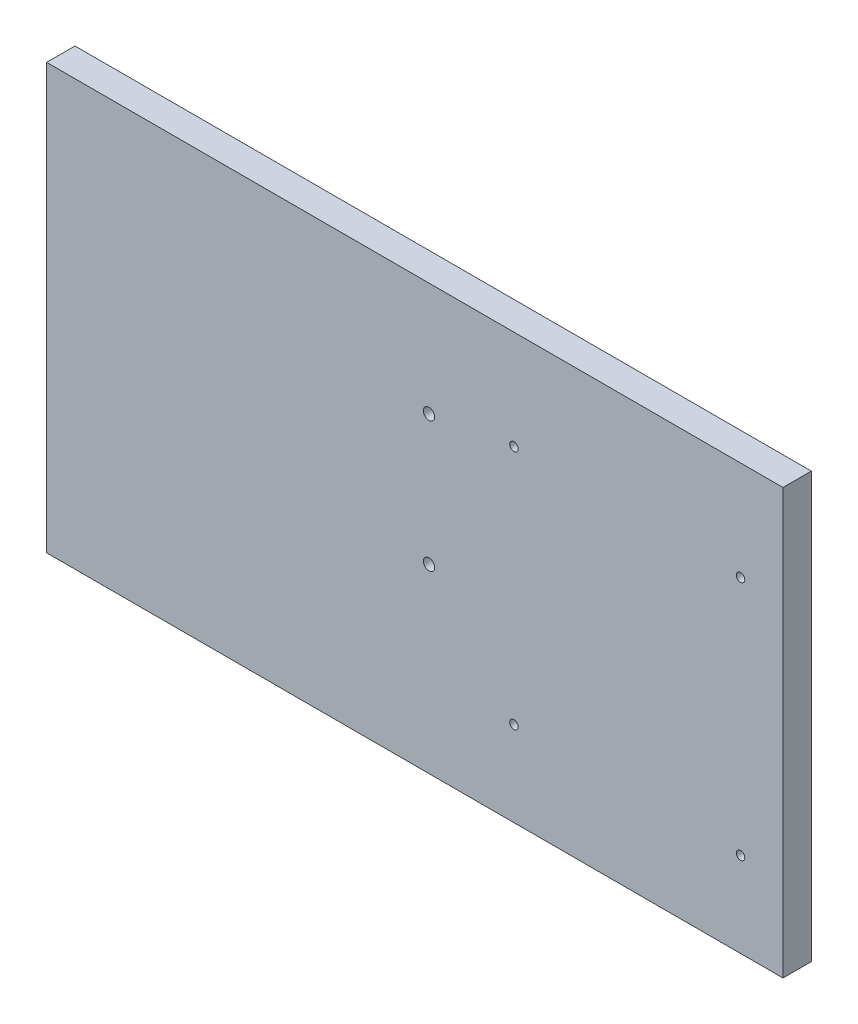
ISO-10303-21;
HEADER;
FILE_DESCRIPTION(('STEP AP214'),'2;1');
FILE_NAME('part.step','',(''),(''),'','','');
FILE_SCHEMA(('AUTOMOTIVE_DESIGN { 1 0 10303 214 1 1 1 1 }'));
ENDSEC;
DATA;
#1=APPLICATION_CONTEXT('core data for automotive mechanical design processes');
#2=APPLICATION_PROTOCOL_DEFINITION('international standard','automotive_design',2000,#1);
#3=PRODUCT_CONTEXT('',#1,'mechanical');
#4=PRODUCT('Part','Part','',(#3));
#5=PRODUCT_RELATED_PRODUCT_CATEGORY('part','',(#4));
#6=PRODUCT_DEFINITION_FORMATION('','',#4);
#7=PRODUCT_DEFINITION_CONTEXT('part definition',#1,'design');
#8=PRODUCT_DEFINITION('design','',#6,#7);
#9=PRODUCT_DEFINITION_SHAPE('','',#8);
#10=(LENGTH_UNIT() NAMED_UNIT(*) SI_UNIT(.MILLI.,.METRE.));
#11=(NAMED_UNIT(*) PLANE_ANGLE_UNIT() SI_UNIT($,.RADIAN.));
#12=(NAMED_UNIT(*) SI_UNIT($,.STERADIAN.) SOLID_ANGLE_UNIT());
#13=UNCERTAINTY_MEASURE_WITH_UNIT(LENGTH_MEASURE(1.E-05),#10,'distance_accuracy_value','');
#14=(GEOMETRIC_REPRESENTATION_CONTEXT(3) GLOBAL_UNCERTAINTY_ASSIGNED_CONTEXT((#13)) GLOBAL_UNIT_ASSIGNED_CONTEXT((#10,
#11,#12)) REPRESENTATION_CONTEXT('',''));
#15=CARTESIAN_POINT('',(0.,0.,0.));
#16=DIRECTION('',(0.,0.,1.));
#17=DIRECTION('',(1.,0.,0.));
#18=AXIS2_PLACEMENT_3D('',#15,#16,#17);
#19=CARTESIAN_POINT('',(130.,0.,10.));
#20=DIRECTION('',(1.,0.,0.));
#21=DIRECTION('',(0.,1.,0.));
#22=AXIS2_PLACEMENT_3D('',#19,#20,#21);
#23=PLANE('',#22);
#24=DIRECTION('',(0.,-1.,0.));
#25=VECTOR('',#24,1.);
#26=CARTESIAN_POINT('',(130.,0.,0.));
#27=LINE('',#26,#25);
#28=CARTESIAN_POINT('',(130.,74.9999999999999,0.));
#29=VERTEX_POINT('',#28);
#30=CARTESIAN_POINT('',(130.,-75.,0.));
#31=VERTEX_POINT('',#30);
#32=EDGE_CURVE('E124',#29,#31,#27,.T.);
#33=ORIENTED_EDGE('',*,*,#32,.F.);
#34=DIRECTION('',(0.,0.,-1.));
#35=VECTOR('',#34,1.);
#36=CARTESIAN_POINT('',(130.,74.9999999999999,10.));
#37=LINE('',#36,#35);
#38=CARTESIAN_POINT('',(130.,74.9999999999999,10.));
#39=VERTEX_POINT('',#38);
#40=EDGE_CURVE('E11',#39,#29,#37,.T.);
#41=ORIENTED_EDGE('',*,*,#40,.F.);
#42=DIRECTION('',(0.,-1.,0.));
#43=VECTOR('',#42,1.);
#44=CARTESIAN_POINT('',(130.,0.,10.));
#45=LINE('',#44,#43);
#46=CARTESIAN_POINT('',(130.,-75.,10.));
#47=VERTEX_POINT('',#46);
#48=EDGE_CURVE('E99',#39,#47,#45,.T.);
#49=ORIENTED_EDGE('',*,*,#48,.T.);
#50=DIRECTION('',(0.,0.,-1.));
#51=VECTOR('',#50,1.);
#52=CARTESIAN_POINT('',(130.,-75.,10.));
#53=LINE('',#52,#51);
#54=EDGE_CURVE('E77',#47,#31,#53,.T.);
#55=ORIENTED_EDGE('',*,*,#54,.T.);
#56=EDGE_LOOP('',(#33,#41,#49,#55));
#57=FACE_BOUND('',#56,.T.);
#58=ADVANCED_FACE('F37',(#57),#23,.T.);
#59=CARTESIAN_POINT('',(0.,75.,10.));
#60=DIRECTION('',(0.,1.,0.));
#61=DIRECTION('',(-1.,0.,0.));
#62=AXIS2_PLACEMENT_3D('',#59,#60,#61);
#63=PLANE('',#62);
#64=DIRECTION('',(1.,0.,0.));
#65=VECTOR('',#64,1.);
#66=CARTESIAN_POINT('',(0.,75.,0.));
#67=LINE('',#66,#65);
#68=CARTESIAN_POINT('',(-130.,75.,0.));
#69=VERTEX_POINT('',#68);
#70=EDGE_CURVE('E89',#69,#29,#67,.T.);
#71=ORIENTED_EDGE('',*,*,#70,.F.);
#72=DIRECTION('',(0.,0.,-1.));
#73=VECTOR('',#72,1.);
#74=CARTESIAN_POINT('',(-130.,75.,10.));
#75=LINE('',#74,#73);
#76=CARTESIAN_POINT('',(-130.,75.,10.));
#77=VERTEX_POINT('',#76);
#78=EDGE_CURVE('E46',#77,#69,#75,.T.);
#79=ORIENTED_EDGE('',*,*,#78,.F.);
#80=DIRECTION('',(1.,0.,0.));
#81=VECTOR('',#80,1.);
#82=CARTESIAN_POINT('',(0.,75.,10.));
#83=LINE('',#82,#81);
#84=EDGE_CURVE('E87',#77,#39,#83,.T.);
#85=ORIENTED_EDGE('',*,*,#84,.T.);
#86=ORIENTED_EDGE('',*,*,#40,.T.);
#87=EDGE_LOOP('',(#71,#79,#85,#86));
#88=FACE_BOUND('',#87,.T.);
#89=ADVANCED_FACE('F85',(#88),#63,.T.);
#90=CARTESIAN_POINT('',(-130.,0.,10.));
#91=DIRECTION('',(1.,0.,0.));
#92=DIRECTION('',(0.,1.,0.));
#93=AXIS2_PLACEMENT_3D('',#90,#91,#92);
#94=PLANE('',#93);
#95=DIRECTION('',(0.,-1.,0.));
#96=VECTOR('',#95,1.);
#97=CARTESIAN_POINT('',(-130.,0.,0.));
#98=LINE('',#97,#96);
#99=CARTESIAN_POINT('',(-130.,-75.,0.));
#100=VERTEX_POINT('',#99);
#101=EDGE_CURVE('E127',#69,#100,#98,.T.);
#102=ORIENTED_EDGE('',*,*,#101,.T.);
#103=DIRECTION('',(0.,0.,-1.));
#104=VECTOR('',#103,1.);
#105=CARTESIAN_POINT('',(-130.,-75.,10.));
#106=LINE('',#105,#104);
#107=CARTESIAN_POINT('',(-130.,-75.,10.));
#108=VERTEX_POINT('',#107);
#109=EDGE_CURVE('E92',#108,#100,#106,.T.);
#110=ORIENTED_EDGE('',*,*,#109,.F.);
#111=DIRECTION('',(0.,-1.,0.));
#112=VECTOR('',#111,1.);
#113=CARTESIAN_POINT('',(-130.,0.,10.));
#114=LINE('',#113,#112);
#115=EDGE_CURVE('E94',#77,#108,#114,.T.);
#116=ORIENTED_EDGE('',*,*,#115,.F.);
#117=ORIENTED_EDGE('',*,*,#78,.T.);
#118=EDGE_LOOP('',(#102,#110,#116,#117));
#119=FACE_BOUND('',#118,.T.);
#120=ADVANCED_FACE('F95',(#119),#94,.F.);
#121=CARTESIAN_POINT('',(0.,-75.,10.));
#122=DIRECTION('',(0.,1.,0.));
#123=DIRECTION('',(-1.,0.,0.));
#124=AXIS2_PLACEMENT_3D('',#121,#122,#123);
#125=PLANE('',#124);
#126=DIRECTION('',(1.,0.,0.));
#127=VECTOR('',#126,1.);
#128=CARTESIAN_POINT('',(0.,-75.,0.));
#129=LINE('',#128,#127);
#130=EDGE_CURVE('E70',#100,#31,#129,.T.);
#131=ORIENTED_EDGE('',*,*,#130,.T.);
#132=ORIENTED_EDGE('',*,*,#54,.F.);
#133=DIRECTION('',(1.,0.,0.));
#134=VECTOR('',#133,1.);
#135=CARTESIAN_POINT('',(0.,-75.,10.));
#136=LINE('',#135,#134);
#137=EDGE_CURVE('E54',#108,#47,#136,.T.);
#138=ORIENTED_EDGE('',*,*,#137,.F.);
#139=ORIENTED_EDGE('',*,*,#109,.T.);
#140=EDGE_LOOP('',(#131,#132,#138,#139));
#141=FACE_BOUND('',#140,.T.);
#142=ADVANCED_FACE('F136',(#141),#125,.F.);
#143=CARTESIAN_POINT('',(115.,39.9999999999994,10.));
#144=DIRECTION('',(0.,0.,-1.));
#145=DIRECTION('',(-1.,0.,0.));
#146=AXIS2_PLACEMENT_3D('',#143,#144,#145);
#147=CYLINDRICAL_SURFACE('',#146,1.5);
#148=CARTESIAN_POINT('',(115.,39.9999999999994,10.));
#149=DIRECTION('',(0.,0.,1.));
#150=DIRECTION('',(1.,0.,0.));
#151=AXIS2_PLACEMENT_3D('',#148,#149,#150);
#152=CIRCLE('',#151,1.5);
#153=CARTESIAN_POINT('',(116.5,39.9999999999994,10.));
#154=VERTEX_POINT('',#153);
#155=EDGE_CURVE('E101',#154,#154,#152,.T.);
#156=ORIENTED_EDGE('',*,*,#155,.T.);
#157=EDGE_LOOP('',(#156));
#158=FACE_BOUND('',#157,.T.);
#159=CARTESIAN_POINT('',(115.,39.9999999999994,0.));
#160=DIRECTION('',(0.,0.,1.));
#161=DIRECTION('',(1.,0.,0.));
#162=AXIS2_PLACEMENT_3D('',#159,#160,#161);
#163=CIRCLE('',#162,1.5);
#164=CARTESIAN_POINT('',(116.5,39.9999999999994,0.));
#165=VERTEX_POINT('',#164);
#166=EDGE_CURVE('E121',#165,#165,#163,.T.);
#167=ORIENTED_EDGE('',*,*,#166,.F.);
#168=EDGE_LOOP('',(#167));
#169=FACE_BOUND('',#168,.T.);
#170=ADVANCED_FACE('F147',(#158,#169),#147,.F.);
#171=CARTESIAN_POINT('',(115.,-45.0000000000006,10.));
#172=DIRECTION('',(0.,0.,-1.));
#173=DIRECTION('',(-1.,0.,0.));
#174=AXIS2_PLACEMENT_3D('',#171,#172,#173);
#175=CYLINDRICAL_SURFACE('',#174,1.5);
#176=CARTESIAN_POINT('',(115.,-45.0000000000006,10.));
#177=DIRECTION('',(0.,0.,1.));
#178=DIRECTION('',(1.,0.,0.));
#179=AXIS2_PLACEMENT_3D('',#176,#177,#178);
#180=CIRCLE('',#179,1.5);
#181=CARTESIAN_POINT('',(116.5,-45.0000000000006,10.));
#182=VERTEX_POINT('',#181);
#183=EDGE_CURVE('E279',#182,#182,#180,.F.);
#184=ORIENTED_EDGE('',*,*,#183,.F.);
#185=EDGE_LOOP('',(#184));
#186=FACE_BOUND('',#185,.T.);
#187=CARTESIAN_POINT('',(115.,-45.0000000000006,0.));
#188=DIRECTION('',(0.,0.,1.));
#189=DIRECTION('',(1.,0.,0.));
#190=AXIS2_PLACEMENT_3D('',#187,#188,#189);
#191=CIRCLE('',#190,1.5);
#192=CARTESIAN_POINT('',(116.5,-45.0000000000006,0.));
#193=VERTEX_POINT('',#192);
#194=EDGE_CURVE('E118',#193,#193,#191,.F.);
#195=ORIENTED_EDGE('',*,*,#194,.T.);
#196=EDGE_LOOP('',(#195));
#197=FACE_BOUND('',#196,.T.);
#198=ADVANCED_FACE('F150',(#186,#197),#175,.F.);
#199=CARTESIAN_POINT('',(35.,39.9999999999994,10.));
#200=DIRECTION('',(0.,0.,-1.));
#201=DIRECTION('',(-1.,0.,0.));
#202=AXIS2_PLACEMENT_3D('',#199,#200,#201);
#203=CYLINDRICAL_SURFACE('',#202,1.5);
#204=CARTESIAN_POINT('',(35.,39.9999999999994,10.));
#205=DIRECTION('',(0.,0.,1.));
#206=DIRECTION('',(1.,0.,0.));
#207=AXIS2_PLACEMENT_3D('',#204,#205,#206);
#208=CIRCLE('',#207,1.5);
#209=CARTESIAN_POINT('',(36.5,39.9999999999994,10.));
#210=VERTEX_POINT('',#209);
#211=EDGE_CURVE('E275',#210,#210,#208,.T.);
#212=ORIENTED_EDGE('',*,*,#211,.T.);
#213=EDGE_LOOP('',(#212));
#214=FACE_BOUND('',#213,.T.);
#215=CARTESIAN_POINT('',(35.,39.9999999999994,0.));
#216=DIRECTION('',(0.,0.,1.));
#217=DIRECTION('',(1.,0.,0.));
#218=AXIS2_PLACEMENT_3D('',#215,#216,#217);
#219=CIRCLE('',#218,1.5);
#220=CARTESIAN_POINT('',(36.5,39.9999999999994,0.));
#221=VERTEX_POINT('',#220);
#222=EDGE_CURVE('E115',#221,#221,#219,.T.);
#223=ORIENTED_EDGE('',*,*,#222,.F.);
#224=EDGE_LOOP('',(#223));
#225=FACE_BOUND('',#224,.T.);
#226=ADVANCED_FACE('F154',(#214,#225),#203,.F.);
#227=CARTESIAN_POINT('',(5.,35.,10.));
#228=DIRECTION('',(0.,0.,-1.));
#229=DIRECTION('',(-1.,0.,0.));
#230=AXIS2_PLACEMENT_3D('',#227,#228,#229);
#231=CYLINDRICAL_SURFACE('',#230,2.);
#232=CARTESIAN_POINT('',(5.,35.,10.));
#233=DIRECTION('',(0.,0.,1.));
#234=DIRECTION('',(1.,0.,0.));
#235=AXIS2_PLACEMENT_3D('',#232,#233,#234);
#236=CIRCLE('',#235,2.);
#237=CARTESIAN_POINT('',(7.00000000000001,35.,10.));
#238=VERTEX_POINT('',#237);
#239=EDGE_CURVE('E169',#238,#238,#236,.T.);
#240=ORIENTED_EDGE('',*,*,#239,.T.);
#241=EDGE_LOOP('',(#240));
#242=FACE_BOUND('',#241,.T.);
#243=CARTESIAN_POINT('',(5.,35.,0.));
#244=DIRECTION('',(0.,0.,1.));
#245=DIRECTION('',(1.,0.,0.));
#246=AXIS2_PLACEMENT_3D('',#243,#244,#245);
#247=CIRCLE('',#246,2.);
#248=CARTESIAN_POINT('',(7.00000000000001,35.,0.));
#249=VERTEX_POINT('',#248);
#250=EDGE_CURVE('E112',#249,#249,#247,.T.);
#251=ORIENTED_EDGE('',*,*,#250,.F.);
#252=EDGE_LOOP('',(#251));
#253=FACE_BOUND('',#252,.T.);
#254=ADVANCED_FACE('F157',(#242,#253),#231,.F.);
#255=CARTESIAN_POINT('',(5.00000000000001,-11.,10.));
#256=DIRECTION('',(0.,0.,-1.));
#257=DIRECTION('',(-1.,0.,0.));
#258=AXIS2_PLACEMENT_3D('',#255,#256,#257);
#259=CYLINDRICAL_SURFACE('',#258,2.);
#260=CARTESIAN_POINT('',(5.00000000000001,-11.,10.));
#261=DIRECTION('',(0.,0.,1.));
#262=DIRECTION('',(1.,0.,0.));
#263=AXIS2_PLACEMENT_3D('',#260,#261,#262);
#264=CIRCLE('',#263,2.);
#265=CARTESIAN_POINT('',(7.00000000000002,-11.,10.));
#266=VERTEX_POINT('',#265);
#267=EDGE_CURVE('E133',#266,#266,#264,.T.);
#268=ORIENTED_EDGE('',*,*,#267,.T.);
#269=EDGE_LOOP('',(#268));
#270=FACE_BOUND('',#269,.T.);
#271=CARTESIAN_POINT('',(5.00000000000001,-11.,0.));
#272=DIRECTION('',(0.,0.,1.));
#273=DIRECTION('',(1.,0.,0.));
#274=AXIS2_PLACEMENT_3D('',#271,#272,#273);
#275=CIRCLE('',#274,2.);
#276=CARTESIAN_POINT('',(7.00000000000002,-11.,0.));
#277=VERTEX_POINT('',#276);
#278=EDGE_CURVE('E109',#277,#277,#275,.T.);
#279=ORIENTED_EDGE('',*,*,#278,.F.);
#280=EDGE_LOOP('',(#279));
#281=FACE_BOUND('',#280,.T.);
#282=ADVANCED_FACE('F39',(#270,#281),#259,.F.);
#283=CARTESIAN_POINT('',(35.,-45.0000000000006,10.));
#284=DIRECTION('',(0.,0.,-1.));
#285=DIRECTION('',(-1.,0.,0.));
#286=AXIS2_PLACEMENT_3D('',#283,#284,#285);
#287=CYLINDRICAL_SURFACE('',#286,1.5);
#288=CARTESIAN_POINT('',(35.,-45.0000000000006,10.));
#289=DIRECTION('',(0.,0.,1.));
#290=DIRECTION('',(1.,0.,0.));
#291=AXIS2_PLACEMENT_3D('',#288,#289,#290);
#292=CIRCLE('',#291,1.5);
#293=CARTESIAN_POINT('',(36.5,-45.0000000000006,10.));
#294=VERTEX_POINT('',#293);
#295=EDGE_CURVE('E106',#294,#294,#292,.F.);
#296=ORIENTED_EDGE('',*,*,#295,.F.);
#297=EDGE_LOOP('',(#296));
#298=FACE_BOUND('',#297,.T.);
#299=CARTESIAN_POINT('',(35.,-45.0000000000006,0.));
#300=DIRECTION('',(0.,0.,1.));
#301=DIRECTION('',(1.,0.,0.));
#302=AXIS2_PLACEMENT_3D('',#299,#300,#301);
#303=CIRCLE('',#302,1.5);
#304=CARTESIAN_POINT('',(36.5,-45.0000000000006,0.));
#305=VERTEX_POINT('',#304);
#306=EDGE_CURVE('E130',#305,#305,#303,.F.);
#307=ORIENTED_EDGE('',*,*,#306,.T.);
#308=EDGE_LOOP('',(#307));
#309=FACE_BOUND('',#308,.T.);
#310=ADVANCED_FACE('F164',(#298,#309),#287,.F.);
#311=CARTESIAN_POINT('',(0.,0.,10.));
#312=DIRECTION('',(0.,0.,1.));
#313=DIRECTION('',(1.,0.,0.));
#314=AXIS2_PLACEMENT_3D('',#311,#312,#313);
#315=PLANE('',#314);
#316=ORIENTED_EDGE('',*,*,#267,.F.);
#317=EDGE_LOOP('',(#316));
#318=FACE_BOUND('',#317,.T.);
#319=ORIENTED_EDGE('',*,*,#239,.F.);
#320=EDGE_LOOP('',(#319));
#321=FACE_BOUND('',#320,.T.);
#322=ORIENTED_EDGE('',*,*,#211,.F.);
#323=EDGE_LOOP('',(#322));
#324=FACE_BOUND('',#323,.T.);
#325=ORIENTED_EDGE('',*,*,#183,.T.);
#326=EDGE_LOOP('',(#325));
#327=FACE_BOUND('',#326,.T.);
#328=ORIENTED_EDGE('',*,*,#155,.F.);
#329=EDGE_LOOP('',(#328));
#330=FACE_BOUND('',#329,.T.);
#331=ORIENTED_EDGE('',*,*,#48,.F.);
#332=ORIENTED_EDGE('',*,*,#84,.F.);
#333=ORIENTED_EDGE('',*,*,#115,.T.);
#334=ORIENTED_EDGE('',*,*,#137,.T.);
#335=EDGE_LOOP('',(#331,#332,#333,#334));
#336=FACE_BOUND('',#335,.T.);
#337=ORIENTED_EDGE('',*,*,#295,.T.);
#338=EDGE_LOOP('',(#337));
#339=FACE_BOUND('',#338,.T.);
#340=ADVANCED_FACE('F97',(#318,#321,#324,#327,#330,#336,#339),#315,.T.);
#341=CARTESIAN_POINT('',(0.,0.,0.));
#342=DIRECTION('',(0.,0.,1.));
#343=DIRECTION('',(1.,0.,0.));
#344=AXIS2_PLACEMENT_3D('',#341,#342,#343);
#345=PLANE('',#344);
#346=ORIENTED_EDGE('',*,*,#278,.T.);
#347=EDGE_LOOP('',(#346));
#348=FACE_BOUND('',#347,.T.);
#349=ORIENTED_EDGE('',*,*,#250,.T.);
#350=EDGE_LOOP('',(#349));
#351=FACE_BOUND('',#350,.T.);
#352=ORIENTED_EDGE('',*,*,#222,.T.);
#353=EDGE_LOOP('',(#352));
#354=FACE_BOUND('',#353,.T.);
#355=ORIENTED_EDGE('',*,*,#194,.F.);
#356=EDGE_LOOP('',(#355));
#357=FACE_BOUND('',#356,.T.);
#358=ORIENTED_EDGE('',*,*,#166,.T.);
#359=EDGE_LOOP('',(#358));
#360=FACE_BOUND('',#359,.T.);
#361=ORIENTED_EDGE('',*,*,#32,.T.);
#362=ORIENTED_EDGE('',*,*,#130,.F.);
#363=ORIENTED_EDGE('',*,*,#101,.F.);
#364=ORIENTED_EDGE('',*,*,#70,.T.);
#365=EDGE_LOOP('',(#361,#362,#363,#364));
#366=FACE_BOUND('',#365,.T.);
#367=ORIENTED_EDGE('',*,*,#306,.F.);
#368=EDGE_LOOP('',(#367));
#369=FACE_BOUND('',#368,.T.);
#370=ADVANCED_FACE('F137',(#348,#351,#354,#357,#360,#366,#369),#345,.F.);
#371=CLOSED_SHELL('',(#58,#89,#120,#142,#170,#198,#226,#254,#282,#310,#340,#370));
#372=MANIFOLD_SOLID_BREP('B2',#371);
#373=ADVANCED_BREP_SHAPE_REPRESENTATION('',(#18,#372),#14);
#374=SHAPE_DEFINITION_REPRESENTATION(#9,#373);
ENDSEC;
END-ISO-10303-21;
